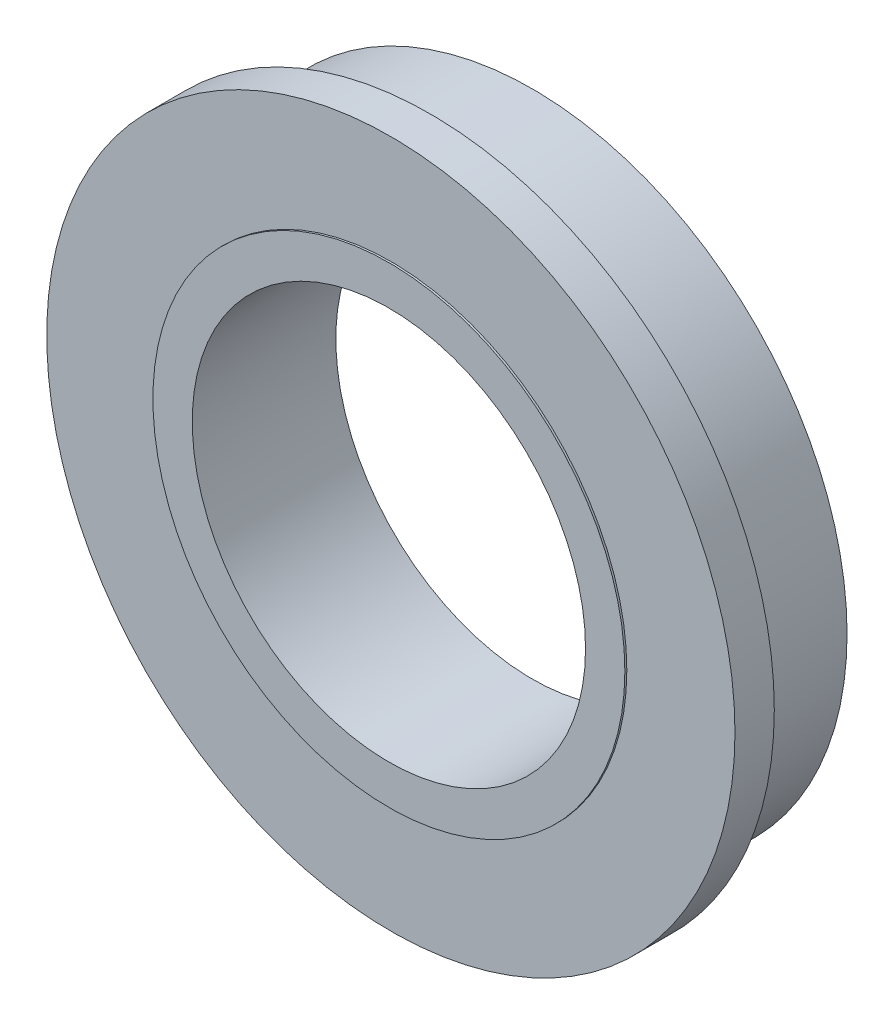
ISO-10303-21;
HEADER;
FILE_DESCRIPTION(('STEP AP214'),'2;1');
FILE_NAME('part.step','',(''),(''),'','','');
FILE_SCHEMA(('AUTOMOTIVE_DESIGN { 1 0 10303 214 1 1 1 1 }'));
ENDSEC;
DATA;
#1=APPLICATION_CONTEXT('core data for automotive mechanical design processes');
#2=APPLICATION_PROTOCOL_DEFINITION('international standard','automotive_design',2000,#1);
#3=PRODUCT_CONTEXT('',#1,'mechanical');
#4=PRODUCT('Part','Part','',(#3));
#5=PRODUCT_RELATED_PRODUCT_CATEGORY('part','',(#4));
#6=PRODUCT_DEFINITION_FORMATION('','',#4);
#7=PRODUCT_DEFINITION_CONTEXT('part definition',#1,'design');
#8=PRODUCT_DEFINITION('design','',#6,#7);
#9=PRODUCT_DEFINITION_SHAPE('','',#8);
#10=(LENGTH_UNIT() NAMED_UNIT(*) SI_UNIT(.MILLI.,.METRE.));
#11=(NAMED_UNIT(*) PLANE_ANGLE_UNIT() SI_UNIT($,.RADIAN.));
#12=(NAMED_UNIT(*) SI_UNIT($,.STERADIAN.) SOLID_ANGLE_UNIT());
#13=UNCERTAINTY_MEASURE_WITH_UNIT(LENGTH_MEASURE(1.E-05),#10,'distance_accuracy_value','');
#14=(GEOMETRIC_REPRESENTATION_CONTEXT(3) GLOBAL_UNCERTAINTY_ASSIGNED_CONTEXT((#13)) GLOBAL_UNIT_ASSIGNED_CONTEXT((#10,
#11,#12)) REPRESENTATION_CONTEXT('',''));
#15=CARTESIAN_POINT('',(0.,0.,0.));
#16=DIRECTION('',(0.,0.,1.));
#17=DIRECTION('',(1.,0.,0.));
#18=AXIS2_PLACEMENT_3D('',#15,#16,#17);
#19=CARTESIAN_POINT('',(0.,0.,7.2));
#20=DIRECTION('',(0.,0.,1.));
#21=DIRECTION('',(1.,0.,0.));
#22=AXIS2_PLACEMENT_3D('',#19,#20,#21);
#23=PLANE('',#22);
#24=CARTESIAN_POINT('',(0.,0.,7.2));
#25=DIRECTION('',(0.,0.,1.));
#26=DIRECTION('',(1.,0.,0.));
#27=AXIS2_PLACEMENT_3D('',#24,#25,#26);
#28=CIRCLE('',#27,17.5);
#29=CARTESIAN_POINT('',(17.5,0.,7.2));
#30=VERTEX_POINT('',#29);
#31=EDGE_CURVE('E52',#30,#30,#28,.T.);
#32=ORIENTED_EDGE('',*,*,#31,.T.);
#33=EDGE_LOOP('',(#32));
#34=FACE_BOUND('',#33,.T.);
#35=CARTESIAN_POINT('',(0.,0.,7.2));
#36=DIRECTION('',(0.,0.,1.));
#37=DIRECTION('',(1.,0.,0.));
#38=AXIS2_PLACEMENT_3D('',#35,#36,#37);
#39=CIRCLE('',#38,12.);
#40=CARTESIAN_POINT('',(12.,0.,7.2));
#41=VERTEX_POINT('',#40);
#42=EDGE_CURVE('E59',#41,#41,#39,.T.);
#43=ORIENTED_EDGE('',*,*,#42,.F.);
#44=EDGE_LOOP('',(#43));
#45=FACE_BOUND('',#44,.T.);
#46=ADVANCED_FACE('F37',(#34,#45),#23,.T.);
#47=CARTESIAN_POINT('',(0.,0.,0.));
#48=DIRECTION('',(0.,0.,1.));
#49=DIRECTION('',(1.,0.,0.));
#50=AXIS2_PLACEMENT_3D('',#47,#48,#49);
#51=PLANE('',#50);
#52=CARTESIAN_POINT('',(0.,0.,0.));
#53=DIRECTION('',(0.,0.,1.));
#54=DIRECTION('',(1.,0.,0.));
#55=AXIS2_PLACEMENT_3D('',#52,#53,#54);
#56=CIRCLE('',#55,16.);
#57=CARTESIAN_POINT('',(16.,0.,0.));
#58=VERTEX_POINT('',#57);
#59=EDGE_CURVE('E41',#58,#58,#56,.T.);
#60=ORIENTED_EDGE('',*,*,#59,.F.);
#61=EDGE_LOOP('',(#60));
#62=FACE_BOUND('',#61,.T.);
#63=CARTESIAN_POINT('',(0.,0.,0.));
#64=DIRECTION('',(0.,0.,1.));
#65=DIRECTION('',(1.,0.,0.));
#66=AXIS2_PLACEMENT_3D('',#63,#64,#65);
#67=CIRCLE('',#66,10.);
#68=CARTESIAN_POINT('',(10.,0.,0.));
#69=VERTEX_POINT('',#68);
#70=EDGE_CURVE('E48',#69,#69,#67,.T.);
#71=ORIENTED_EDGE('',*,*,#70,.T.);
#72=EDGE_LOOP('',(#71));
#73=FACE_BOUND('',#72,.T.);
#74=ADVANCED_FACE('F87',(#62,#73),#51,.F.);
#75=CARTESIAN_POINT('',(0.,0.,5.2));
#76=DIRECTION('',(0.,0.,-1.));
#77=DIRECTION('',(-1.,0.,0.));
#78=AXIS2_PLACEMENT_3D('',#75,#76,#77);
#79=CYLINDRICAL_SURFACE('',#78,16.);
#80=CARTESIAN_POINT('',(0.,0.,5.2));
#81=DIRECTION('',(0.,0.,1.));
#82=DIRECTION('',(1.,0.,0.));
#83=AXIS2_PLACEMENT_3D('',#80,#81,#82);
#84=CIRCLE('',#83,16.);
#85=CARTESIAN_POINT('',(16.,0.,5.2));
#86=VERTEX_POINT('',#85);
#87=EDGE_CURVE('E10',#86,#86,#84,.T.);
#88=ORIENTED_EDGE('',*,*,#87,.F.);
#89=EDGE_LOOP('',(#88));
#90=FACE_BOUND('',#89,.T.);
#91=ORIENTED_EDGE('',*,*,#59,.T.);
#92=EDGE_LOOP('',(#91));
#93=FACE_BOUND('',#92,.T.);
#94=ADVANCED_FACE('F39',(#90,#93),#79,.T.);
#95=CARTESIAN_POINT('',(0.,0.,5.2));
#96=DIRECTION('',(0.,0.,-1.));
#97=DIRECTION('',(-1.,0.,0.));
#98=AXIS2_PLACEMENT_3D('',#95,#96,#97);
#99=CYLINDRICAL_SURFACE('',#98,10.);
#100=ORIENTED_EDGE('',*,*,#70,.F.);
#101=EDGE_LOOP('',(#100));
#102=FACE_BOUND('',#101,.T.);
#103=CARTESIAN_POINT('',(0.,0.,7.3));
#104=DIRECTION('',(0.,0.,1.));
#105=DIRECTION('',(1.,0.,0.));
#106=AXIS2_PLACEMENT_3D('',#103,#104,#105);
#107=CIRCLE('',#106,10.);
#108=CARTESIAN_POINT('',(10.,0.,7.3));
#109=VERTEX_POINT('',#108);
#110=EDGE_CURVE('E62',#109,#109,#107,.T.);
#111=ORIENTED_EDGE('',*,*,#110,.T.);
#112=EDGE_LOOP('',(#111));
#113=FACE_BOUND('',#112,.T.);
#114=ADVANCED_FACE('F68',(#102,#113),#99,.F.);
#115=CARTESIAN_POINT('',(0.,0.,5.2));
#116=DIRECTION('',(0.,0.,1.));
#117=DIRECTION('',(1.,0.,0.));
#118=AXIS2_PLACEMENT_3D('',#115,#116,#117);
#119=PLANE('',#118);
#120=ORIENTED_EDGE('',*,*,#87,.T.);
#121=EDGE_LOOP('',(#120));
#122=FACE_BOUND('',#121,.T.);
#123=CARTESIAN_POINT('',(0.,0.,5.2));
#124=DIRECTION('',(0.,0.,1.));
#125=DIRECTION('',(1.,0.,0.));
#126=AXIS2_PLACEMENT_3D('',#123,#124,#125);
#127=CIRCLE('',#126,17.5);
#128=CARTESIAN_POINT('',(17.5,0.,5.2));
#129=VERTEX_POINT('',#128);
#130=EDGE_CURVE('E53',#129,#129,#127,.T.);
#131=ORIENTED_EDGE('',*,*,#130,.F.);
#132=EDGE_LOOP('',(#131));
#133=FACE_BOUND('',#132,.T.);
#134=ADVANCED_FACE('F83',(#122,#133),#119,.F.);
#135=CARTESIAN_POINT('',(0.,0.,7.2));
#136=DIRECTION('',(0.,0.,-1.));
#137=DIRECTION('',(-1.,0.,0.));
#138=AXIS2_PLACEMENT_3D('',#135,#136,#137);
#139=CYLINDRICAL_SURFACE('',#138,17.5);
#140=ORIENTED_EDGE('',*,*,#31,.F.);
#141=EDGE_LOOP('',(#140));
#142=FACE_BOUND('',#141,.T.);
#143=ORIENTED_EDGE('',*,*,#130,.T.);
#144=EDGE_LOOP('',(#143));
#145=FACE_BOUND('',#144,.T.);
#146=ADVANCED_FACE('F73',(#142,#145),#139,.T.);
#147=CARTESIAN_POINT('',(0.,0.,7.3));
#148=DIRECTION('',(0.,0.,1.));
#149=DIRECTION('',(1.,0.,0.));
#150=AXIS2_PLACEMENT_3D('',#147,#148,#149);
#151=PLANE('',#150);
#152=CARTESIAN_POINT('',(0.,0.,7.3));
#153=DIRECTION('',(0.,0.,1.));
#154=DIRECTION('',(1.,0.,0.));
#155=AXIS2_PLACEMENT_3D('',#152,#153,#154);
#156=CIRCLE('',#155,12.);
#157=CARTESIAN_POINT('',(12.,0.,7.3));
#158=VERTEX_POINT('',#157);
#159=EDGE_CURVE('E56',#158,#158,#156,.T.);
#160=ORIENTED_EDGE('',*,*,#159,.T.);
#161=EDGE_LOOP('',(#160));
#162=FACE_BOUND('',#161,.T.);
#163=ORIENTED_EDGE('',*,*,#110,.F.);
#164=EDGE_LOOP('',(#163));
#165=FACE_BOUND('',#164,.T.);
#166=ADVANCED_FACE('F70',(#162,#165),#151,.T.);
#167=CARTESIAN_POINT('',(0.,0.,7.3));
#168=DIRECTION('',(0.,0.,-1.));
#169=DIRECTION('',(-1.,0.,0.));
#170=AXIS2_PLACEMENT_3D('',#167,#168,#169);
#171=CYLINDRICAL_SURFACE('',#170,12.);
#172=ORIENTED_EDGE('',*,*,#159,.F.);
#173=EDGE_LOOP('',(#172));
#174=FACE_BOUND('',#173,.T.);
#175=ORIENTED_EDGE('',*,*,#42,.T.);
#176=EDGE_LOOP('',(#175));
#177=FACE_BOUND('',#176,.T.);
#178=ADVANCED_FACE('F72',(#174,#177),#171,.T.);
#179=CLOSED_SHELL('',(#46,#74,#94,#114,#134,#146,#166,#178));
#180=MANIFOLD_SOLID_BREP('B2',#179);
#181=ADVANCED_BREP_SHAPE_REPRESENTATION('',(#18,#180),#14);
#182=SHAPE_DEFINITION_REPRESENTATION(#9,#181);
ENDSEC;
END-ISO-10303-21;
